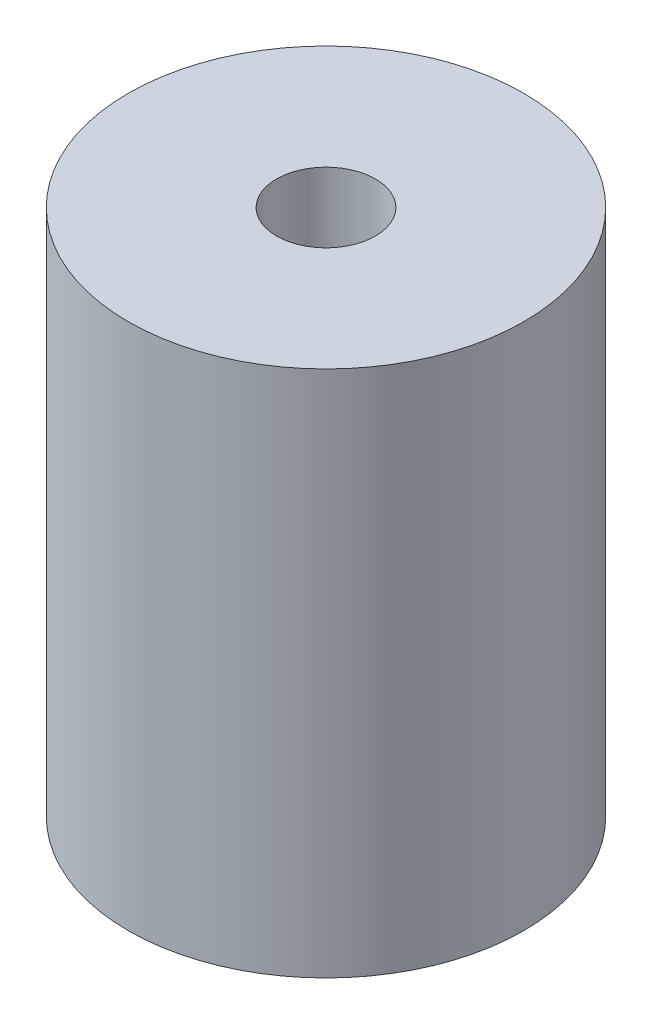
ISO-10303-21;
HEADER;
FILE_DESCRIPTION(('STEP AP214'),'2;1');
FILE_NAME('part.step','',(''),(''),'','','');
FILE_SCHEMA(('AUTOMOTIVE_DESIGN { 1 0 10303 214 1 1 1 1 }'));
ENDSEC;
DATA;
#1=APPLICATION_CONTEXT('core data for automotive mechanical design processes');
#2=APPLICATION_PROTOCOL_DEFINITION('international standard','automotive_design',2000,#1);
#3=PRODUCT_CONTEXT('',#1,'mechanical');
#4=PRODUCT('Part','Part','',(#3));
#5=PRODUCT_RELATED_PRODUCT_CATEGORY('part','',(#4));
#6=PRODUCT_DEFINITION_FORMATION('','',#4);
#7=PRODUCT_DEFINITION_CONTEXT('part definition',#1,'design');
#8=PRODUCT_DEFINITION('design','',#6,#7);
#9=PRODUCT_DEFINITION_SHAPE('','',#8);
#10=(LENGTH_UNIT() NAMED_UNIT(*) SI_UNIT(.MILLI.,.METRE.));
#11=(NAMED_UNIT(*) PLANE_ANGLE_UNIT() SI_UNIT($,.RADIAN.));
#12=(NAMED_UNIT(*) SI_UNIT($,.STERADIAN.) SOLID_ANGLE_UNIT());
#13=UNCERTAINTY_MEASURE_WITH_UNIT(LENGTH_MEASURE(1.E-05),#10,'distance_accuracy_value','');
#14=(GEOMETRIC_REPRESENTATION_CONTEXT(3) GLOBAL_UNCERTAINTY_ASSIGNED_CONTEXT((#13)) GLOBAL_UNIT_ASSIGNED_CONTEXT((#10,
#11,#12)) REPRESENTATION_CONTEXT('',''));
#15=CARTESIAN_POINT('',(0.,0.,0.));
#16=DIRECTION('',(0.,0.,1.));
#17=DIRECTION('',(1.,0.,0.));
#18=AXIS2_PLACEMENT_3D('',#15,#16,#17);
#19=CARTESIAN_POINT('',(0.,25.4,0.));
#20=DIRECTION('',(0.,-1.,0.));
#21=DIRECTION('',(0.,0.,-1.));
#22=AXIS2_PLACEMENT_3D('',#19,#20,#21);
#23=CYLINDRICAL_SURFACE('',#22,9.525);
#24=CARTESIAN_POINT('',(0.,25.4,0.));
#25=DIRECTION('',(0.,1.,0.));
#26=DIRECTION('',(0.,0.,1.));
#27=AXIS2_PLACEMENT_3D('',#24,#25,#26);
#28=CIRCLE('',#27,9.525);
#29=CARTESIAN_POINT('',(0.,25.4,9.525));
#30=VERTEX_POINT('',#29);
#31=EDGE_CURVE('E10',#30,#30,#28,.T.);
#32=ORIENTED_EDGE('',*,*,#31,.F.);
#33=EDGE_LOOP('',(#32));
#34=FACE_BOUND('',#33,.T.);
#35=CARTESIAN_POINT('',(0.,0.,0.));
#36=DIRECTION('',(0.,1.,0.));
#37=DIRECTION('',(0.,0.,1.));
#38=AXIS2_PLACEMENT_3D('',#35,#36,#37);
#39=CIRCLE('',#38,9.525);
#40=CARTESIAN_POINT('',(0.,0.,9.525));
#41=VERTEX_POINT('',#40);
#42=EDGE_CURVE('E38',#41,#41,#39,.T.);
#43=ORIENTED_EDGE('',*,*,#42,.T.);
#44=EDGE_LOOP('',(#43));
#45=FACE_BOUND('',#44,.T.);
#46=ADVANCED_FACE('F35',(#34,#45),#23,.T.);
#47=CARTESIAN_POINT('',(0.,25.4,0.));
#48=DIRECTION('',(0.,1.,0.));
#49=DIRECTION('',(0.,0.,1.));
#50=AXIS2_PLACEMENT_3D('',#47,#48,#49);
#51=PLANE('',#50);
#52=CARTESIAN_POINT('',(0.,25.4,0.));
#53=DIRECTION('',(0.,1.,0.));
#54=DIRECTION('',(0.,0.,1.));
#55=AXIS2_PLACEMENT_3D('',#52,#53,#54);
#56=CIRCLE('',#55,2.38125);
#57=CARTESIAN_POINT('',(0.,25.4,2.38125));
#58=VERTEX_POINT('',#57);
#59=EDGE_CURVE('E45',#58,#58,#56,.T.);
#60=ORIENTED_EDGE('',*,*,#59,.F.);
#61=EDGE_LOOP('',(#60));
#62=FACE_BOUND('',#61,.T.);
#63=ORIENTED_EDGE('',*,*,#31,.T.);
#64=EDGE_LOOP('',(#63));
#65=FACE_BOUND('',#64,.T.);
#66=ADVANCED_FACE('F72',(#62,#65),#51,.T.);
#67=CARTESIAN_POINT('',(0.,0.,0.));
#68=DIRECTION('',(0.,1.,0.));
#69=DIRECTION('',(0.,0.,1.));
#70=AXIS2_PLACEMENT_3D('',#67,#68,#69);
#71=PLANE('',#70);
#72=CARTESIAN_POINT('',(0.,0.,0.));
#73=DIRECTION('',(0.,-1.,0.));
#74=DIRECTION('',(0.,0.,-1.));
#75=AXIS2_PLACEMENT_3D('',#72,#73,#74);
#76=CIRCLE('',#75,3.175);
#77=CARTESIAN_POINT('',(0.,0.,-3.175));
#78=VERTEX_POINT('',#77);
#79=EDGE_CURVE('E53',#78,#78,#76,.T.);
#80=ORIENTED_EDGE('',*,*,#79,.F.);
#81=EDGE_LOOP('',(#80));
#82=FACE_BOUND('',#81,.T.);
#83=ORIENTED_EDGE('',*,*,#42,.F.);
#84=EDGE_LOOP('',(#83));
#85=FACE_BOUND('',#84,.T.);
#86=ADVANCED_FACE('F68',(#82,#85),#71,.F.);
#87=CARTESIAN_POINT('',(0.,12.7,0.));
#88=DIRECTION('',(0.,1.,0.));
#89=DIRECTION('',(0.,0.,1.));
#90=AXIS2_PLACEMENT_3D('',#87,#88,#89);
#91=CYLINDRICAL_SURFACE('',#90,2.38125);
#92=CARTESIAN_POINT('',(0.,12.7,0.));
#93=DIRECTION('',(0.,1.,0.));
#94=DIRECTION('',(0.,0.,1.));
#95=AXIS2_PLACEMENT_3D('',#92,#93,#94);
#96=CIRCLE('',#95,2.38125);
#97=CARTESIAN_POINT('',(0.,12.7,2.38125));
#98=VERTEX_POINT('',#97);
#99=EDGE_CURVE('E49',#98,#98,#96,.T.);
#100=ORIENTED_EDGE('',*,*,#99,.F.);
#101=EDGE_LOOP('',(#100));
#102=FACE_BOUND('',#101,.T.);
#103=ORIENTED_EDGE('',*,*,#59,.T.);
#104=EDGE_LOOP('',(#103));
#105=FACE_BOUND('',#104,.T.);
#106=ADVANCED_FACE('F71',(#102,#105),#91,.F.);
#107=CARTESIAN_POINT('',(0.,12.7,0.));
#108=DIRECTION('',(0.,-1.,0.));
#109=DIRECTION('',(0.,0.,-1.));
#110=AXIS2_PLACEMENT_3D('',#107,#108,#109);
#111=PLANE('',#110);
#112=CARTESIAN_POINT('',(0.,12.7,0.));
#113=DIRECTION('',(0.,-1.,0.));
#114=DIRECTION('',(0.,0.,-1.));
#115=AXIS2_PLACEMENT_3D('',#112,#113,#114);
#116=CIRCLE('',#115,3.175);
#117=CARTESIAN_POINT('',(0.,12.7,-3.175));
#118=VERTEX_POINT('',#117);
#119=EDGE_CURVE('E52',#118,#118,#116,.T.);
#120=ORIENTED_EDGE('',*,*,#119,.T.);
#121=EDGE_LOOP('',(#120));
#122=FACE_BOUND('',#121,.T.);
#123=ORIENTED_EDGE('',*,*,#99,.T.);
#124=EDGE_LOOP('',(#123));
#125=FACE_BOUND('',#124,.T.);
#126=ADVANCED_FACE('F59',(#122,#125),#111,.T.);
#127=CARTESIAN_POINT('',(0.,12.7,0.));
#128=DIRECTION('',(0.,-1.,0.));
#129=DIRECTION('',(0.,0.,-1.));
#130=AXIS2_PLACEMENT_3D('',#127,#128,#129);
#131=CYLINDRICAL_SURFACE('',#130,3.175);
#132=ORIENTED_EDGE('',*,*,#119,.F.);
#133=EDGE_LOOP('',(#132));
#134=FACE_BOUND('',#133,.T.);
#135=ORIENTED_EDGE('',*,*,#79,.T.);
#136=EDGE_LOOP('',(#135));
#137=FACE_BOUND('',#136,.T.);
#138=ADVANCED_FACE('F62',(#134,#137),#131,.F.);
#139=CLOSED_SHELL('',(#46,#66,#86,#106,#126,#138));
#140=MANIFOLD_SOLID_BREP('B2',#139);
#141=ADVANCED_BREP_SHAPE_REPRESENTATION('',(#18,#140),#14);
#142=SHAPE_DEFINITION_REPRESENTATION(#9,#141);
ENDSEC;
END-ISO-10303-21;
